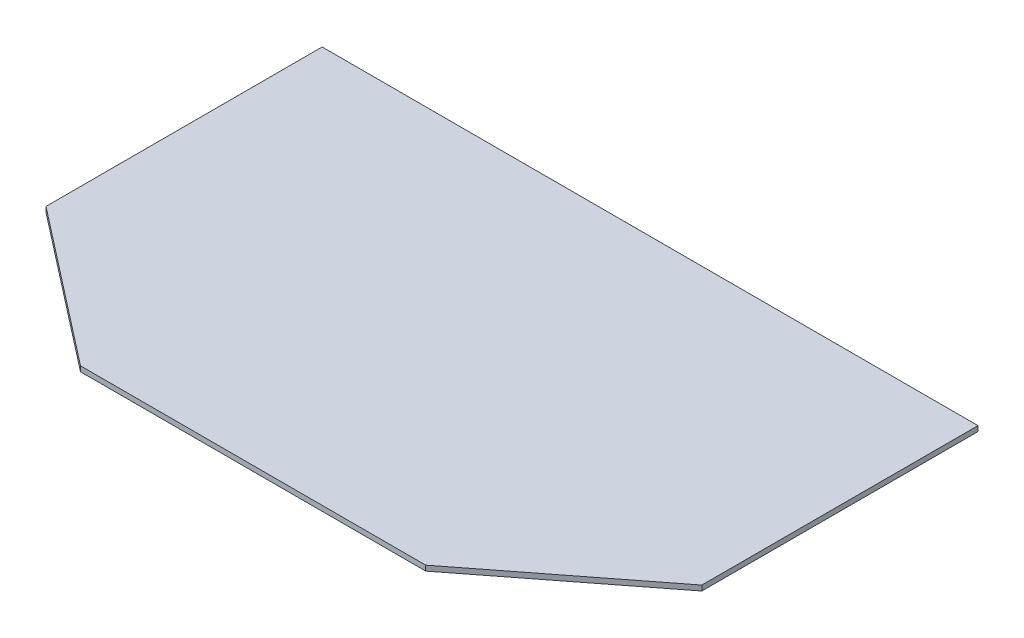
ISO-10303-21;
HEADER;
FILE_DESCRIPTION(('STEP AP214'),'2;1');
FILE_NAME('part.step','',(''),(''),'','','');
FILE_SCHEMA(('AUTOMOTIVE_DESIGN { 1 0 10303 214 1 1 1 1 }'));
ENDSEC;
DATA;
#1=APPLICATION_CONTEXT('core data for automotive mechanical design processes');
#2=APPLICATION_PROTOCOL_DEFINITION('international standard','automotive_design',2000,#1);
#3=PRODUCT_CONTEXT('',#1,'mechanical');
#4=PRODUCT('Part','Part','',(#3));
#5=PRODUCT_RELATED_PRODUCT_CATEGORY('part','',(#4));
#6=PRODUCT_DEFINITION_FORMATION('','',#4);
#7=PRODUCT_DEFINITION_CONTEXT('part definition',#1,'design');
#8=PRODUCT_DEFINITION('design','',#6,#7);
#9=PRODUCT_DEFINITION_SHAPE('','',#8);
#10=(LENGTH_UNIT() NAMED_UNIT(*) SI_UNIT(.MILLI.,.METRE.));
#11=(NAMED_UNIT(*) PLANE_ANGLE_UNIT() SI_UNIT($,.RADIAN.));
#12=(NAMED_UNIT(*) SI_UNIT($,.STERADIAN.) SOLID_ANGLE_UNIT());
#13=UNCERTAINTY_MEASURE_WITH_UNIT(LENGTH_MEASURE(1.E-05),#10,'distance_accuracy_value','');
#14=(GEOMETRIC_REPRESENTATION_CONTEXT(3) GLOBAL_UNCERTAINTY_ASSIGNED_CONTEXT((#13)) GLOBAL_UNIT_ASSIGNED_CONTEXT((#10,
#11,#12)) REPRESENTATION_CONTEXT('',''));
#15=CARTESIAN_POINT('',(0.,0.,0.));
#16=DIRECTION('',(0.,0.,1.));
#17=DIRECTION('',(1.,0.,0.));
#18=AXIS2_PLACEMENT_3D('',#15,#16,#17);
#19=CARTESIAN_POINT('',(-190.,3.,-80.));
#20=DIRECTION('',(0.,0.,1.));
#21=DIRECTION('',(1.,0.,0.));
#22=AXIS2_PLACEMENT_3D('',#19,#20,#21);
#23=PLANE('',#22);
#24=DIRECTION('',(-1.,0.,0.));
#25=VECTOR('',#24,1.);
#26=CARTESIAN_POINT('',(-190.,0.,-80.));
#27=LINE('',#26,#25);
#28=CARTESIAN_POINT('',(190.,0.,-80.));
#29=VERTEX_POINT('',#28);
#30=CARTESIAN_POINT('',(-190.,0.,-80.));
#31=VERTEX_POINT('',#30);
#32=EDGE_CURVE('E122',#29,#31,#27,.T.);
#33=ORIENTED_EDGE('',*,*,#32,.T.);
#34=DIRECTION('',(0.,-1.,0.));
#35=VECTOR('',#34,1.);
#36=CARTESIAN_POINT('',(-190.,3.,-80.));
#37=LINE('',#36,#35);
#38=CARTESIAN_POINT('',(-190.,3.,-80.));
#39=VERTEX_POINT('',#38);
#40=EDGE_CURVE('E41',#39,#31,#37,.T.);
#41=ORIENTED_EDGE('',*,*,#40,.F.);
#42=DIRECTION('',(-1.,0.,0.));
#43=VECTOR('',#42,1.);
#44=CARTESIAN_POINT('',(-190.,3.,-80.));
#45=LINE('',#44,#43);
#46=CARTESIAN_POINT('',(190.,3.,-80.));
#47=VERTEX_POINT('',#46);
#48=EDGE_CURVE('E88',#47,#39,#45,.T.);
#49=ORIENTED_EDGE('',*,*,#48,.F.);
#50=DIRECTION('',(0.,-1.,0.));
#51=VECTOR('',#50,1.);
#52=CARTESIAN_POINT('',(190.,3.,-80.));
#53=LINE('',#52,#51);
#54=EDGE_CURVE('E11',#47,#29,#53,.T.);
#55=ORIENTED_EDGE('',*,*,#54,.T.);
#56=EDGE_LOOP('',(#33,#41,#49,#55));
#57=FACE_BOUND('',#56,.T.);
#58=ADVANCED_FACE('F33',(#57),#23,.F.);
#59=CARTESIAN_POINT('',(-190.,3.,80.));
#60=DIRECTION('',(1.,0.,0.));
#61=DIRECTION('',(0.,0.,-1.));
#62=AXIS2_PLACEMENT_3D('',#59,#60,#61);
#63=PLANE('',#62);
#64=DIRECTION('',(0.,0.,1.));
#65=VECTOR('',#64,1.);
#66=CARTESIAN_POINT('',(-190.,0.,80.));
#67=LINE('',#66,#65);
#68=CARTESIAN_POINT('',(-190.,0.,80.));
#69=VERTEX_POINT('',#68);
#70=EDGE_CURVE('E125',#31,#69,#67,.T.);
#71=ORIENTED_EDGE('',*,*,#70,.T.);
#72=DIRECTION('',(0.,-1.,0.));
#73=VECTOR('',#72,1.);
#74=CARTESIAN_POINT('',(-190.,3.,80.));
#75=LINE('',#74,#73);
#76=CARTESIAN_POINT('',(-190.,3.,80.));
#77=VERTEX_POINT('',#76);
#78=EDGE_CURVE('E111',#77,#69,#75,.T.);
#79=ORIENTED_EDGE('',*,*,#78,.F.);
#80=DIRECTION('',(0.,0.,1.));
#81=VECTOR('',#80,1.);
#82=CARTESIAN_POINT('',(-190.,3.,-60.));
#83=LINE('',#82,#81);
#84=EDGE_CURVE('E102',#39,#77,#83,.T.);
#85=ORIENTED_EDGE('',*,*,#84,.F.);
#86=ORIENTED_EDGE('',*,*,#40,.T.);
#87=EDGE_LOOP('',(#71,#79,#85,#86));
#88=FACE_BOUND('',#87,.T.);
#89=ADVANCED_FACE('F136',(#88),#63,.F.);
#90=CARTESIAN_POINT('',(-99.9999999999999,3.,150.));
#91=DIRECTION('',(0.61394061351492,0.,-0.789352217376326));
#92=DIRECTION('',(-0.789352217376326,0.,-0.613940613514921));
#93=AXIS2_PLACEMENT_3D('',#90,#91,#92);
#94=PLANE('',#93);
#95=DIRECTION('',(0.789352217376326,0.,0.613940613514921));
#96=VECTOR('',#95,1.);
#97=CARTESIAN_POINT('',(-99.9999999999999,0.,150.));
#98=LINE('',#97,#96);
#99=CARTESIAN_POINT('',(-99.9999999999999,0.,150.));
#100=VERTEX_POINT('',#99);
#101=EDGE_CURVE('E110',#69,#100,#98,.T.);
#102=ORIENTED_EDGE('',*,*,#101,.T.);
#103=DIRECTION('',(0.,-1.,0.));
#104=VECTOR('',#103,1.);
#105=CARTESIAN_POINT('',(-99.9999999999999,3.,150.));
#106=LINE('',#105,#104);
#107=CARTESIAN_POINT('',(-99.9999999999999,3.,150.));
#108=VERTEX_POINT('',#107);
#109=EDGE_CURVE('E107',#108,#100,#106,.T.);
#110=ORIENTED_EDGE('',*,*,#109,.F.);
#111=DIRECTION('',(0.789352217376326,0.,0.613940613514921));
#112=VECTOR('',#111,1.);
#113=CARTESIAN_POINT('',(-99.9999999999999,3.,150.));
#114=LINE('',#113,#112);
#115=EDGE_CURVE('E96',#77,#108,#114,.T.);
#116=ORIENTED_EDGE('',*,*,#115,.F.);
#117=ORIENTED_EDGE('',*,*,#78,.T.);
#118=EDGE_LOOP('',(#102,#110,#116,#117));
#119=FACE_BOUND('',#118,.T.);
#120=ADVANCED_FACE('F108',(#119),#94,.F.);
#121=CARTESIAN_POINT('',(100.,3.,150.));
#122=DIRECTION('',(0.,0.,-1.));
#123=DIRECTION('',(-1.,0.,0.));
#124=AXIS2_PLACEMENT_3D('',#121,#122,#123);
#125=PLANE('',#124);
#126=DIRECTION('',(1.,0.,0.));
#127=VECTOR('',#126,1.);
#128=CARTESIAN_POINT('',(100.,0.,150.));
#129=LINE('',#128,#127);
#130=CARTESIAN_POINT('',(100.,0.,150.));
#131=VERTEX_POINT('',#130);
#132=EDGE_CURVE('E73',#100,#131,#129,.T.);
#133=ORIENTED_EDGE('',*,*,#132,.T.);
#134=DIRECTION('',(0.,-1.,0.));
#135=VECTOR('',#134,1.);
#136=CARTESIAN_POINT('',(100.,3.,150.));
#137=LINE('',#136,#135);
#138=CARTESIAN_POINT('',(100.,3.,150.));
#139=VERTEX_POINT('',#138);
#140=EDGE_CURVE('E112',#139,#131,#137,.T.);
#141=ORIENTED_EDGE('',*,*,#140,.F.);
#142=DIRECTION('',(1.,0.,0.));
#143=VECTOR('',#142,1.);
#144=CARTESIAN_POINT('',(100.,3.,150.));
#145=LINE('',#144,#143);
#146=EDGE_CURVE('E100',#108,#139,#145,.T.);
#147=ORIENTED_EDGE('',*,*,#146,.F.);
#148=ORIENTED_EDGE('',*,*,#109,.T.);
#149=EDGE_LOOP('',(#133,#141,#147,#148));
#150=FACE_BOUND('',#149,.T.);
#151=ADVANCED_FACE('F114',(#150),#125,.F.);
#152=CARTESIAN_POINT('',(190.,3.,80.));
#153=DIRECTION('',(-0.61394061351492,0.,-0.789352217376326));
#154=DIRECTION('',(-0.789352217376326,0.,0.61394061351492));
#155=AXIS2_PLACEMENT_3D('',#152,#153,#154);
#156=PLANE('',#155);
#157=DIRECTION('',(0.789352217376326,0.,-0.61394061351492));
#158=VECTOR('',#157,1.);
#159=CARTESIAN_POINT('',(190.,0.,80.));
#160=LINE('',#159,#158);
#161=CARTESIAN_POINT('',(190.,0.,80.));
#162=VERTEX_POINT('',#161);
#163=EDGE_CURVE('E129',#131,#162,#160,.T.);
#164=ORIENTED_EDGE('',*,*,#163,.T.);
#165=DIRECTION('',(0.,-1.,0.));
#166=VECTOR('',#165,1.);
#167=CARTESIAN_POINT('',(190.,3.,80.));
#168=LINE('',#167,#166);
#169=CARTESIAN_POINT('',(190.,3.,80.));
#170=VERTEX_POINT('',#169);
#171=EDGE_CURVE('E118',#170,#162,#168,.T.);
#172=ORIENTED_EDGE('',*,*,#171,.F.);
#173=DIRECTION('',(0.789352217376326,0.,-0.61394061351492));
#174=VECTOR('',#173,1.);
#175=CARTESIAN_POINT('',(190.,3.,80.));
#176=LINE('',#175,#174);
#177=EDGE_CURVE('E116',#139,#170,#176,.T.);
#178=ORIENTED_EDGE('',*,*,#177,.F.);
#179=ORIENTED_EDGE('',*,*,#140,.T.);
#180=EDGE_LOOP('',(#164,#172,#178,#179));
#181=FACE_BOUND('',#180,.T.);
#182=ADVANCED_FACE('F140',(#181),#156,.F.);
#183=CARTESIAN_POINT('',(190.,3.,-60.));
#184=DIRECTION('',(-1.,0.,0.));
#185=DIRECTION('',(0.,0.,1.));
#186=AXIS2_PLACEMENT_3D('',#183,#184,#185);
#187=PLANE('',#186);
#188=DIRECTION('',(0.,0.,-1.));
#189=VECTOR('',#188,1.);
#190=CARTESIAN_POINT('',(190.,0.,-60.));
#191=LINE('',#190,#189);
#192=EDGE_CURVE('E80',#162,#29,#191,.T.);
#193=ORIENTED_EDGE('',*,*,#192,.T.);
#194=ORIENTED_EDGE('',*,*,#54,.F.);
#195=DIRECTION('',(0.,0.,-1.));
#196=VECTOR('',#195,1.);
#197=CARTESIAN_POINT('',(190.,3.,-80.));
#198=LINE('',#197,#196);
#199=EDGE_CURVE('E49',#170,#47,#198,.T.);
#200=ORIENTED_EDGE('',*,*,#199,.F.);
#201=ORIENTED_EDGE('',*,*,#171,.T.);
#202=EDGE_LOOP('',(#193,#194,#200,#201));
#203=FACE_BOUND('',#202,.T.);
#204=ADVANCED_FACE('F141',(#203),#187,.F.);
#205=CARTESIAN_POINT('',(0.,3.,0.));
#206=DIRECTION('',(0.,-1.,0.));
#207=DIRECTION('',(0.,0.,-1.));
#208=AXIS2_PLACEMENT_3D('',#205,#206,#207);
#209=PLANE('',#208);
#210=ORIENTED_EDGE('',*,*,#199,.T.);
#211=ORIENTED_EDGE('',*,*,#48,.T.);
#212=ORIENTED_EDGE('',*,*,#84,.T.);
#213=ORIENTED_EDGE('',*,*,#115,.T.);
#214=ORIENTED_EDGE('',*,*,#146,.T.);
#215=ORIENTED_EDGE('',*,*,#177,.T.);
#216=EDGE_LOOP('',(#210,#211,#212,#213,#214,#215));
#217=FACE_BOUND('',#216,.T.);
#218=ADVANCED_FACE('F98',(#217),#209,.F.);
#219=CARTESIAN_POINT('',(0.,0.,0.));
#220=DIRECTION('',(0.,-1.,0.));
#221=DIRECTION('',(0.,0.,-1.));
#222=AXIS2_PLACEMENT_3D('',#219,#220,#221);
#223=PLANE('',#222);
#224=ORIENTED_EDGE('',*,*,#32,.F.);
#225=ORIENTED_EDGE('',*,*,#192,.F.);
#226=ORIENTED_EDGE('',*,*,#163,.F.);
#227=ORIENTED_EDGE('',*,*,#132,.F.);
#228=ORIENTED_EDGE('',*,*,#101,.F.);
#229=ORIENTED_EDGE('',*,*,#70,.F.);
#230=EDGE_LOOP('',(#224,#225,#226,#227,#228,#229));
#231=FACE_BOUND('',#230,.T.);
#232=ADVANCED_FACE('F137',(#231),#223,.T.);
#233=CLOSED_SHELL('',(#58,#89,#120,#151,#182,#204,#218,#232));
#234=MANIFOLD_SOLID_BREP('B2',#233);
#235=ADVANCED_BREP_SHAPE_REPRESENTATION('',(#18,#234),#14);
#236=SHAPE_DEFINITION_REPRESENTATION(#9,#235);
ENDSEC;
END-ISO-10303-21;
